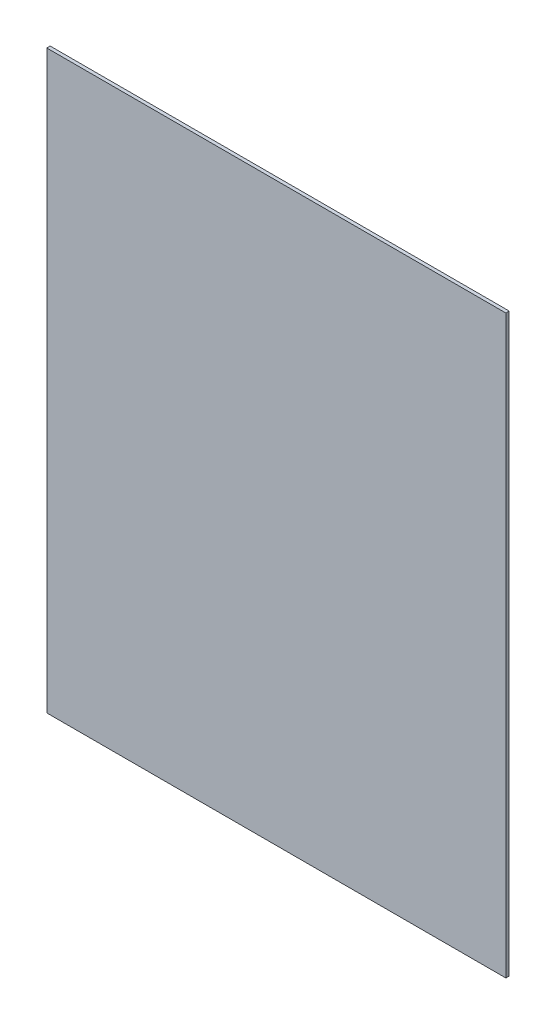
ISO-10303-21;
HEADER;
FILE_DESCRIPTION(('STEP AP214'),'2;1');
FILE_NAME('part.step','',(''),(''),'','','');
FILE_SCHEMA(('AUTOMOTIVE_DESIGN { 1 0 10303 214 1 1 1 1 }'));
ENDSEC;
DATA;
#1=APPLICATION_CONTEXT('core data for automotive mechanical design processes');
#2=APPLICATION_PROTOCOL_DEFINITION('international standard','automotive_design',2000,#1);
#3=PRODUCT_CONTEXT('',#1,'mechanical');
#4=PRODUCT('Part','Part','',(#3));
#5=PRODUCT_RELATED_PRODUCT_CATEGORY('part','',(#4));
#6=PRODUCT_DEFINITION_FORMATION('','',#4);
#7=PRODUCT_DEFINITION_CONTEXT('part definition',#1,'design');
#8=PRODUCT_DEFINITION('design','',#6,#7);
#9=PRODUCT_DEFINITION_SHAPE('','',#8);
#10=(LENGTH_UNIT() NAMED_UNIT(*) SI_UNIT(.MILLI.,.METRE.));
#11=(NAMED_UNIT(*) PLANE_ANGLE_UNIT() SI_UNIT($,.RADIAN.));
#12=(NAMED_UNIT(*) SI_UNIT($,.STERADIAN.) SOLID_ANGLE_UNIT());
#13=UNCERTAINTY_MEASURE_WITH_UNIT(LENGTH_MEASURE(1.E-05),#10,'distance_accuracy_value','');
#14=(GEOMETRIC_REPRESENTATION_CONTEXT(3) GLOBAL_UNCERTAINTY_ASSIGNED_CONTEXT((#13)) GLOBAL_UNIT_ASSIGNED_CONTEXT((#10,
#11,#12)) REPRESENTATION_CONTEXT('',''));
#15=CARTESIAN_POINT('',(0.,0.,0.));
#16=DIRECTION('',(0.,0.,1.));
#17=DIRECTION('',(1.,0.,0.));
#18=AXIS2_PLACEMENT_3D('',#15,#16,#17);
#19=CARTESIAN_POINT('',(0.,0.,3.175));
#20=DIRECTION('',(1.,0.,0.));
#21=DIRECTION('',(0.,0.,-1.));
#22=AXIS2_PLACEMENT_3D('',#19,#20,#21);
#23=PLANE('',#22);
#24=DIRECTION('',(0.,-1.,0.));
#25=VECTOR('',#24,1.);
#26=CARTESIAN_POINT('',(0.,0.,0.));
#27=LINE('',#26,#25);
#28=CARTESIAN_POINT('',(0.,539.75,0.));
#29=VERTEX_POINT('',#28);
#30=CARTESIAN_POINT('',(0.,0.,0.));
#31=VERTEX_POINT('',#30);
#32=EDGE_CURVE('E95',#29,#31,#27,.T.);
#33=ORIENTED_EDGE('',*,*,#32,.T.);
#34=DIRECTION('',(0.,0.,-1.));
#35=VECTOR('',#34,1.);
#36=CARTESIAN_POINT('',(0.,0.,3.175));
#37=LINE('',#36,#35);
#38=CARTESIAN_POINT('',(0.,0.,3.175));
#39=VERTEX_POINT('',#38);
#40=EDGE_CURVE('E11',#39,#31,#37,.T.);
#41=ORIENTED_EDGE('',*,*,#40,.F.);
#42=DIRECTION('',(0.,-1.,0.));
#43=VECTOR('',#42,1.);
#44=CARTESIAN_POINT('',(0.,0.,3.175));
#45=LINE('',#44,#43);
#46=CARTESIAN_POINT('',(0.,539.75,3.175));
#47=VERTEX_POINT('',#46);
#48=EDGE_CURVE('E83',#47,#39,#45,.T.);
#49=ORIENTED_EDGE('',*,*,#48,.F.);
#50=DIRECTION('',(0.,0.,-1.));
#51=VECTOR('',#50,1.);
#52=CARTESIAN_POINT('',(0.,539.75,3.175));
#53=LINE('',#52,#51);
#54=EDGE_CURVE('E91',#47,#29,#53,.T.);
#55=ORIENTED_EDGE('',*,*,#54,.T.);
#56=EDGE_LOOP('',(#33,#41,#49,#55));
#57=FACE_BOUND('',#56,.T.);
#58=ADVANCED_FACE('F32',(#57),#23,.F.);
#59=CARTESIAN_POINT('',(0.,0.,3.175));
#60=DIRECTION('',(0.,1.,0.));
#61=DIRECTION('',(0.,0.,1.));
#62=AXIS2_PLACEMENT_3D('',#59,#60,#61);
#63=PLANE('',#62);
#64=DIRECTION('',(1.,0.,0.));
#65=VECTOR('',#64,1.);
#66=CARTESIAN_POINT('',(0.,0.,0.));
#67=LINE('',#66,#65);
#68=CARTESIAN_POINT('',(430.276,0.,0.));
#69=VERTEX_POINT('',#68);
#70=EDGE_CURVE('E87',#31,#69,#67,.T.);
#71=ORIENTED_EDGE('',*,*,#70,.T.);
#72=DIRECTION('',(0.,0.,-1.));
#73=VECTOR('',#72,1.);
#74=CARTESIAN_POINT('',(430.276,0.,3.175));
#75=LINE('',#74,#73);
#76=CARTESIAN_POINT('',(430.276,0.,3.175));
#77=VERTEX_POINT('',#76);
#78=EDGE_CURVE('E40',#77,#69,#75,.T.);
#79=ORIENTED_EDGE('',*,*,#78,.F.);
#80=DIRECTION('',(1.,0.,0.));
#81=VECTOR('',#80,1.);
#82=CARTESIAN_POINT('',(0.,0.,3.175));
#83=LINE('',#82,#81);
#84=EDGE_CURVE('E78',#39,#77,#83,.T.);
#85=ORIENTED_EDGE('',*,*,#84,.F.);
#86=ORIENTED_EDGE('',*,*,#40,.T.);
#87=EDGE_LOOP('',(#71,#79,#85,#86));
#88=FACE_BOUND('',#87,.T.);
#89=ADVANCED_FACE('F86',(#88),#63,.F.);
#90=CARTESIAN_POINT('',(430.276,0.,3.175));
#91=DIRECTION('',(-1.,0.,0.));
#92=DIRECTION('',(0.,0.,1.));
#93=AXIS2_PLACEMENT_3D('',#90,#91,#92);
#94=PLANE('',#93);
#95=DIRECTION('',(0.,1.,0.));
#96=VECTOR('',#95,1.);
#97=CARTESIAN_POINT('',(430.276,0.,0.));
#98=LINE('',#97,#96);
#99=CARTESIAN_POINT('',(430.276,539.75,0.));
#100=VERTEX_POINT('',#99);
#101=EDGE_CURVE('E65',#69,#100,#98,.T.);
#102=ORIENTED_EDGE('',*,*,#101,.T.);
#103=DIRECTION('',(0.,0.,-1.));
#104=VECTOR('',#103,1.);
#105=CARTESIAN_POINT('',(430.276,539.75,3.175));
#106=LINE('',#105,#104);
#107=CARTESIAN_POINT('',(430.276,539.75,3.175));
#108=VERTEX_POINT('',#107);
#109=EDGE_CURVE('E88',#108,#100,#106,.T.);
#110=ORIENTED_EDGE('',*,*,#109,.F.);
#111=DIRECTION('',(0.,1.,0.));
#112=VECTOR('',#111,1.);
#113=CARTESIAN_POINT('',(430.276,0.,3.175));
#114=LINE('',#113,#112);
#115=EDGE_CURVE('E81',#77,#108,#114,.T.);
#116=ORIENTED_EDGE('',*,*,#115,.F.);
#117=ORIENTED_EDGE('',*,*,#78,.T.);
#118=EDGE_LOOP('',(#102,#110,#116,#117));
#119=FACE_BOUND('',#118,.T.);
#120=ADVANCED_FACE('F89',(#119),#94,.F.);
#121=CARTESIAN_POINT('',(0.,539.75,3.175));
#122=DIRECTION('',(0.,-1.,0.));
#123=DIRECTION('',(0.,0.,-1.));
#124=AXIS2_PLACEMENT_3D('',#121,#122,#123);
#125=PLANE('',#124);
#126=DIRECTION('',(-1.,0.,0.));
#127=VECTOR('',#126,1.);
#128=CARTESIAN_POINT('',(0.,539.75,0.));
#129=LINE('',#128,#127);
#130=EDGE_CURVE('E71',#100,#29,#129,.T.);
#131=ORIENTED_EDGE('',*,*,#130,.T.);
#132=ORIENTED_EDGE('',*,*,#54,.F.);
#133=DIRECTION('',(-1.,0.,0.));
#134=VECTOR('',#133,1.);
#135=CARTESIAN_POINT('',(0.,539.75,3.175));
#136=LINE('',#135,#134);
#137=EDGE_CURVE('E48',#108,#47,#136,.T.);
#138=ORIENTED_EDGE('',*,*,#137,.F.);
#139=ORIENTED_EDGE('',*,*,#109,.T.);
#140=EDGE_LOOP('',(#131,#132,#138,#139));
#141=FACE_BOUND('',#140,.T.);
#142=ADVANCED_FACE('F102',(#141),#125,.F.);
#143=CARTESIAN_POINT('',(0.,0.,3.175));
#144=DIRECTION('',(0.,0.,-1.));
#145=DIRECTION('',(-1.,0.,0.));
#146=AXIS2_PLACEMENT_3D('',#143,#144,#145);
#147=PLANE('',#146);
#148=ORIENTED_EDGE('',*,*,#48,.T.);
#149=ORIENTED_EDGE('',*,*,#84,.T.);
#150=ORIENTED_EDGE('',*,*,#115,.T.);
#151=ORIENTED_EDGE('',*,*,#137,.T.);
#152=EDGE_LOOP('',(#148,#149,#150,#151));
#153=FACE_BOUND('',#152,.T.);
#154=ADVANCED_FACE('F79',(#153),#147,.F.);
#155=CARTESIAN_POINT('',(0.,0.,0.));
#156=DIRECTION('',(0.,0.,-1.));
#157=DIRECTION('',(-1.,0.,0.));
#158=AXIS2_PLACEMENT_3D('',#155,#156,#157);
#159=PLANE('',#158);
#160=ORIENTED_EDGE('',*,*,#32,.F.);
#161=ORIENTED_EDGE('',*,*,#130,.F.);
#162=ORIENTED_EDGE('',*,*,#101,.F.);
#163=ORIENTED_EDGE('',*,*,#70,.F.);
#164=EDGE_LOOP('',(#160,#161,#162,#163));
#165=FACE_BOUND('',#164,.T.);
#166=ADVANCED_FACE('F105',(#165),#159,.T.);
#167=CLOSED_SHELL('',(#58,#89,#120,#142,#154,#166));
#168=MANIFOLD_SOLID_BREP('B2',#167);
#169=ADVANCED_BREP_SHAPE_REPRESENTATION('',(#18,#168),#14);
#170=SHAPE_DEFINITION_REPRESENTATION(#9,#169);
ENDSEC;
END-ISO-10303-21;
